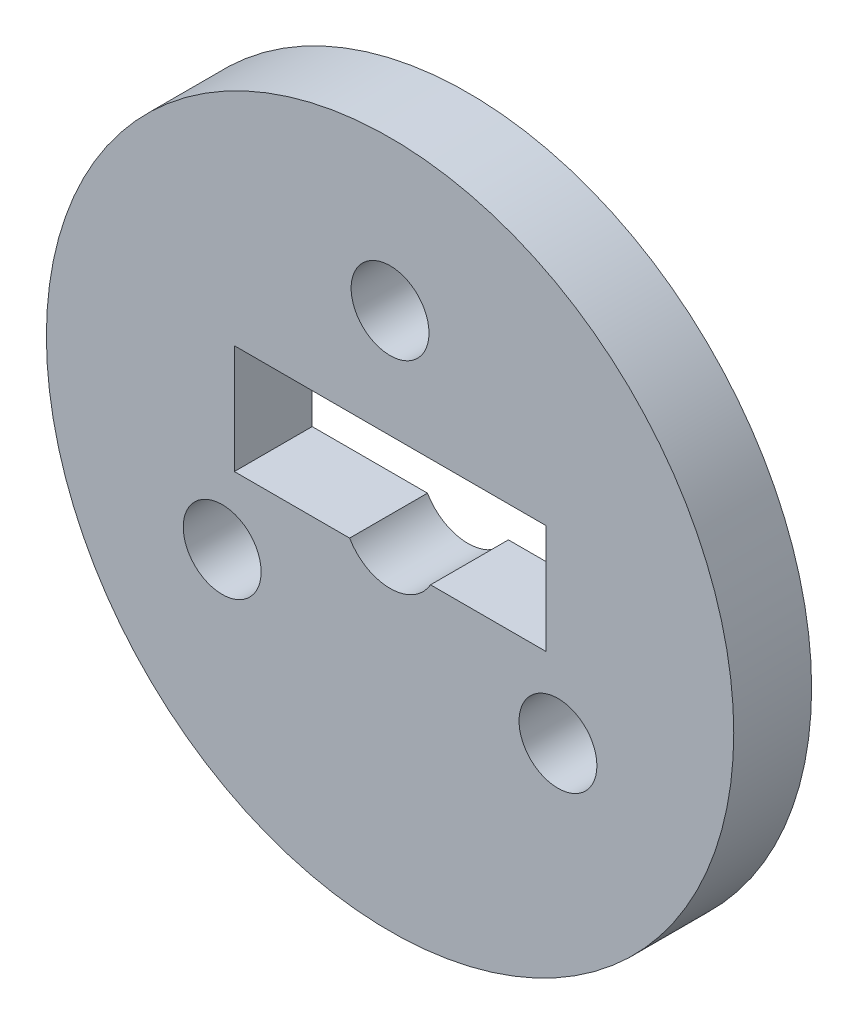
ISO-10303-21;
HEADER;
FILE_DESCRIPTION(('STEP AP214'),'2;1');
FILE_NAME('part.step','',(''),(''),'','','');
FILE_SCHEMA(('AUTOMOTIVE_DESIGN { 1 0 10303 214 1 1 1 1 }'));
ENDSEC;
DATA;
#1=APPLICATION_CONTEXT('core data for automotive mechanical design processes');
#2=APPLICATION_PROTOCOL_DEFINITION('international standard','automotive_design',2000,#1);
#3=PRODUCT_CONTEXT('',#1,'mechanical');
#4=PRODUCT('Part','Part','',(#3));
#5=PRODUCT_RELATED_PRODUCT_CATEGORY('part','',(#4));
#6=PRODUCT_DEFINITION_FORMATION('','',#4);
#7=PRODUCT_DEFINITION_CONTEXT('part definition',#1,'design');
#8=PRODUCT_DEFINITION('design','',#6,#7);
#9=PRODUCT_DEFINITION_SHAPE('','',#8);
#10=(LENGTH_UNIT() NAMED_UNIT(*) SI_UNIT(.MILLI.,.METRE.));
#11=(NAMED_UNIT(*) PLANE_ANGLE_UNIT() SI_UNIT($,.RADIAN.));
#12=(NAMED_UNIT(*) SI_UNIT($,.STERADIAN.) SOLID_ANGLE_UNIT());
#13=UNCERTAINTY_MEASURE_WITH_UNIT(LENGTH_MEASURE(1.E-05),#10,'distance_accuracy_value','');
#14=(GEOMETRIC_REPRESENTATION_CONTEXT(3) GLOBAL_UNCERTAINTY_ASSIGNED_CONTEXT((#13)) GLOBAL_UNIT_ASSIGNED_CONTEXT((#10,
#11,#12)) REPRESENTATION_CONTEXT('',''));
#15=CARTESIAN_POINT('',(0.,0.,0.));
#16=DIRECTION('',(0.,0.,1.));
#17=DIRECTION('',(1.,0.,0.));
#18=AXIS2_PLACEMENT_3D('',#15,#16,#17);
#19=CARTESIAN_POINT('',(0.,0.,5.));
#20=DIRECTION('',(0.,0.,-1.));
#21=DIRECTION('',(-1.,0.,0.));
#22=AXIS2_PLACEMENT_3D('',#19,#20,#21);
#23=CYLINDRICAL_SURFACE('',#22,3.);
#24=CARTESIAN_POINT('',(0.,0.,0.));
#25=DIRECTION('',(0.,0.,1.));
#26=DIRECTION('',(1.,0.,0.));
#27=AXIS2_PLACEMENT_3D('',#24,#25,#26);
#28=CIRCLE('',#27,3.);
#29=CARTESIAN_POINT('',(-2.59807621135332,-1.49999999999999,0.));
#30=VERTEX_POINT('',#29);
#31=CARTESIAN_POINT('',(2.59807621135332,-1.49999999999999,0.));
#32=VERTEX_POINT('',#31);
#33=EDGE_CURVE('E132',#30,#32,#28,.T.);
#34=ORIENTED_EDGE('',*,*,#33,.F.);
#35=DIRECTION('',(0.,0.,-1.));
#36=VECTOR('',#35,1.);
#37=CARTESIAN_POINT('',(-2.59807621135332,-1.49999999999999,5.));
#38=LINE('',#37,#36);
#39=CARTESIAN_POINT('',(-2.59807621135332,-1.49999999999999,5.));
#40=VERTEX_POINT('',#39);
#41=EDGE_CURVE('E11',#40,#30,#38,.T.);
#42=ORIENTED_EDGE('',*,*,#41,.F.);
#43=CARTESIAN_POINT('',(0.,0.,5.));
#44=DIRECTION('',(0.,0.,1.));
#45=DIRECTION('',(1.,0.,0.));
#46=AXIS2_PLACEMENT_3D('',#43,#44,#45);
#47=CIRCLE('',#46,3.);
#48=CARTESIAN_POINT('',(2.59807621135332,-1.49999999999999,5.));
#49=VERTEX_POINT('',#48);
#50=EDGE_CURVE('E157',#40,#49,#47,.T.);
#51=ORIENTED_EDGE('',*,*,#50,.T.);
#52=DIRECTION('',(0.,0.,-1.));
#53=VECTOR('',#52,1.);
#54=CARTESIAN_POINT('',(2.59807621135332,-1.49999999999999,5.));
#55=LINE('',#54,#53);
#56=EDGE_CURVE('E81',#49,#32,#55,.T.);
#57=ORIENTED_EDGE('',*,*,#56,.T.);
#58=EDGE_LOOP('',(#34,#42,#51,#57));
#59=FACE_BOUND('',#58,.T.);
#60=ADVANCED_FACE('F37',(#59),#23,.F.);
#61=CARTESIAN_POINT('',(0.,-1.49999999999999,5.));
#62=DIRECTION('',(0.,-1.,0.));
#63=DIRECTION('',(0.,0.,-1.));
#64=AXIS2_PLACEMENT_3D('',#61,#62,#63);
#65=PLANE('',#64);
#66=DIRECTION('',(-1.,0.,0.));
#67=VECTOR('',#66,1.);
#68=CARTESIAN_POINT('',(0.,-1.49999999999999,0.));
#69=LINE('',#68,#67);
#70=CARTESIAN_POINT('',(-10.,-1.49999999999999,0.));
#71=VERTEX_POINT('',#70);
#72=EDGE_CURVE('E135',#30,#71,#69,.T.);
#73=ORIENTED_EDGE('',*,*,#72,.T.);
#74=DIRECTION('',(0.,0.,-1.));
#75=VECTOR('',#74,1.);
#76=CARTESIAN_POINT('',(-10.,-1.49999999999999,5.));
#77=LINE('',#76,#75);
#78=CARTESIAN_POINT('',(-10.,-1.49999999999999,5.));
#79=VERTEX_POINT('',#78);
#80=EDGE_CURVE('E45',#79,#71,#77,.T.);
#81=ORIENTED_EDGE('',*,*,#80,.F.);
#82=DIRECTION('',(-1.,0.,0.));
#83=VECTOR('',#82,1.);
#84=CARTESIAN_POINT('',(0.,-1.49999999999999,5.));
#85=LINE('',#84,#83);
#86=EDGE_CURVE('E118',#40,#79,#85,.T.);
#87=ORIENTED_EDGE('',*,*,#86,.F.);
#88=ORIENTED_EDGE('',*,*,#41,.T.);
#89=EDGE_LOOP('',(#73,#81,#87,#88));
#90=FACE_BOUND('',#89,.T.);
#91=ADVANCED_FACE('F166',(#90),#65,.F.);
#92=CARTESIAN_POINT('',(-10.,0.,5.));
#93=DIRECTION('',(1.,0.,0.));
#94=DIRECTION('',(0.,1.,0.));
#95=AXIS2_PLACEMENT_3D('',#92,#93,#94);
#96=PLANE('',#95);
#97=DIRECTION('',(0.,-1.,0.));
#98=VECTOR('',#97,1.);
#99=CARTESIAN_POINT('',(-10.,0.,0.));
#100=LINE('',#99,#98);
#101=CARTESIAN_POINT('',(-10.0000000000001,5.50000000000001,0.));
#102=VERTEX_POINT('',#101);
#103=EDGE_CURVE('E138',#102,#71,#100,.T.);
#104=ORIENTED_EDGE('',*,*,#103,.F.);
#105=DIRECTION('',(0.,0.,-1.));
#106=VECTOR('',#105,1.);
#107=CARTESIAN_POINT('',(-10.0000000000001,5.50000000000001,5.));
#108=LINE('',#107,#106);
#109=CARTESIAN_POINT('',(-10.0000000000001,5.50000000000001,5.));
#110=VERTEX_POINT('',#109);
#111=EDGE_CURVE('E105',#110,#102,#108,.T.);
#112=ORIENTED_EDGE('',*,*,#111,.F.);
#113=DIRECTION('',(0.,-1.,0.));
#114=VECTOR('',#113,1.);
#115=CARTESIAN_POINT('',(-10.,0.,5.));
#116=LINE('',#115,#114);
#117=EDGE_CURVE('E112',#110,#79,#116,.T.);
#118=ORIENTED_EDGE('',*,*,#117,.T.);
#119=ORIENTED_EDGE('',*,*,#80,.T.);
#120=EDGE_LOOP('',(#104,#112,#118,#119));
#121=FACE_BOUND('',#120,.T.);
#122=ADVANCED_FACE('F163',(#121),#96,.T.);
#123=CARTESIAN_POINT('',(0.,5.50000000000001,5.));
#124=DIRECTION('',(0.,-1.,0.));
#125=DIRECTION('',(1.,0.,0.));
#126=AXIS2_PLACEMENT_3D('',#123,#124,#125);
#127=PLANE('',#126);
#128=DIRECTION('',(-1.,0.,0.));
#129=VECTOR('',#128,1.);
#130=CARTESIAN_POINT('',(0.,5.50000000000001,0.));
#131=LINE('',#130,#129);
#132=CARTESIAN_POINT('',(10.,5.50000000000001,0.));
#133=VERTEX_POINT('',#132);
#134=EDGE_CURVE('E100',#133,#102,#131,.T.);
#135=ORIENTED_EDGE('',*,*,#134,.F.);
#136=DIRECTION('',(0.,0.,-1.));
#137=VECTOR('',#136,1.);
#138=CARTESIAN_POINT('',(10.,5.50000000000001,5.));
#139=LINE('',#138,#137);
#140=CARTESIAN_POINT('',(10.,5.50000000000001,5.));
#141=VERTEX_POINT('',#140);
#142=EDGE_CURVE('E95',#141,#133,#139,.T.);
#143=ORIENTED_EDGE('',*,*,#142,.F.);
#144=DIRECTION('',(-1.,0.,0.));
#145=VECTOR('',#144,1.);
#146=CARTESIAN_POINT('',(0.,5.50000000000001,5.));
#147=LINE('',#146,#145);
#148=EDGE_CURVE('E98',#141,#110,#147,.T.);
#149=ORIENTED_EDGE('',*,*,#148,.T.);
#150=ORIENTED_EDGE('',*,*,#111,.T.);
#151=EDGE_LOOP('',(#135,#143,#149,#150));
#152=FACE_BOUND('',#151,.T.);
#153=ADVANCED_FACE('F97',(#152),#127,.T.);
#154=CARTESIAN_POINT('',(10.,0.,5.));
#155=DIRECTION('',(-1.,0.,0.));
#156=DIRECTION('',(0.,-1.,0.));
#157=AXIS2_PLACEMENT_3D('',#154,#155,#156);
#158=PLANE('',#157);
#159=DIRECTION('',(0.,1.,0.));
#160=VECTOR('',#159,1.);
#161=CARTESIAN_POINT('',(10.,0.,0.));
#162=LINE('',#161,#160);
#163=CARTESIAN_POINT('',(9.99999999999999,-1.49999999999999,0.));
#164=VERTEX_POINT('',#163);
#165=EDGE_CURVE('E143',#164,#133,#162,.T.);
#166=ORIENTED_EDGE('',*,*,#165,.F.);
#167=DIRECTION('',(0.,0.,-1.));
#168=VECTOR('',#167,1.);
#169=CARTESIAN_POINT('',(9.99999999999999,-1.49999999999999,5.));
#170=LINE('',#169,#168);
#171=CARTESIAN_POINT('',(9.99999999999999,-1.49999999999999,5.));
#172=VERTEX_POINT('',#171);
#173=EDGE_CURVE('E74',#172,#164,#170,.T.);
#174=ORIENTED_EDGE('',*,*,#173,.F.);
#175=DIRECTION('',(0.,1.,0.));
#176=VECTOR('',#175,1.);
#177=CARTESIAN_POINT('',(10.,0.,5.));
#178=LINE('',#177,#176);
#179=EDGE_CURVE('E110',#172,#141,#178,.T.);
#180=ORIENTED_EDGE('',*,*,#179,.T.);
#181=ORIENTED_EDGE('',*,*,#142,.T.);
#182=EDGE_LOOP('',(#166,#174,#180,#181));
#183=FACE_BOUND('',#182,.T.);
#184=ADVANCED_FACE('F114',(#183),#158,.T.);
#185=CARTESIAN_POINT('',(0.,12.45,5.));
#186=DIRECTION('',(0.,0.,-1.));
#187=DIRECTION('',(-1.,0.,0.));
#188=AXIS2_PLACEMENT_3D('',#185,#186,#187);
#189=CYLINDRICAL_SURFACE('',#188,2.5);
#190=CARTESIAN_POINT('',(0.,12.45,5.));
#191=DIRECTION('',(0.,0.,1.));
#192=DIRECTION('',(1.,0.,0.));
#193=AXIS2_PLACEMENT_3D('',#190,#191,#192);
#194=CIRCLE('',#193,2.5);
#195=CARTESIAN_POINT('',(2.5,12.45,5.));
#196=VERTEX_POINT('',#195);
#197=EDGE_CURVE('E126',#196,#196,#194,.T.);
#198=ORIENTED_EDGE('',*,*,#197,.T.);
#199=EDGE_LOOP('',(#198));
#200=FACE_BOUND('',#199,.T.);
#201=CARTESIAN_POINT('',(0.,12.45,0.));
#202=DIRECTION('',(0.,0.,1.));
#203=DIRECTION('',(1.,0.,0.));
#204=AXIS2_PLACEMENT_3D('',#201,#202,#203);
#205=CIRCLE('',#204,2.5);
#206=CARTESIAN_POINT('',(2.5,12.45,0.));
#207=VERTEX_POINT('',#206);
#208=EDGE_CURVE('E151',#207,#207,#205,.T.);
#209=ORIENTED_EDGE('',*,*,#208,.F.);
#210=EDGE_LOOP('',(#209));
#211=FACE_BOUND('',#210,.T.);
#212=ADVANCED_FACE('F196',(#200,#211),#189,.F.);
#213=CARTESIAN_POINT('',(10.7820162771163,-6.225,5.));
#214=DIRECTION('',(0.,0.,-1.));
#215=DIRECTION('',(-1.,0.,0.));
#216=AXIS2_PLACEMENT_3D('',#213,#214,#215);
#217=CYLINDRICAL_SURFACE('',#216,2.5);
#218=CARTESIAN_POINT('',(10.7820162771163,-6.225,5.));
#219=DIRECTION('',(0.,0.,1.));
#220=DIRECTION('',(1.,0.,0.));
#221=AXIS2_PLACEMENT_3D('',#218,#219,#220);
#222=CIRCLE('',#221,2.5);
#223=CARTESIAN_POINT('',(13.2820162771163,-6.225,5.));
#224=VERTEX_POINT('',#223);
#225=EDGE_CURVE('E123',#224,#224,#222,.T.);
#226=ORIENTED_EDGE('',*,*,#225,.T.);
#227=EDGE_LOOP('',(#226));
#228=FACE_BOUND('',#227,.T.);
#229=CARTESIAN_POINT('',(10.7820162771163,-6.225,0.));
#230=DIRECTION('',(0.,0.,1.));
#231=DIRECTION('',(1.,0.,0.));
#232=AXIS2_PLACEMENT_3D('',#229,#230,#231);
#233=CIRCLE('',#232,2.5);
#234=CARTESIAN_POINT('',(13.2820162771163,-6.225,0.));
#235=VERTEX_POINT('',#234);
#236=EDGE_CURVE('E148',#235,#235,#233,.T.);
#237=ORIENTED_EDGE('',*,*,#236,.F.);
#238=EDGE_LOOP('',(#237));
#239=FACE_BOUND('',#238,.T.);
#240=ADVANCED_FACE('F191',(#228,#239),#217,.F.);
#241=CARTESIAN_POINT('',(-10.7820162771163,-6.225,5.));
#242=DIRECTION('',(0.,0.,-1.));
#243=DIRECTION('',(-1.,0.,0.));
#244=AXIS2_PLACEMENT_3D('',#241,#242,#243);
#245=CYLINDRICAL_SURFACE('',#244,2.5);
#246=CARTESIAN_POINT('',(-10.7820162771163,-6.225,5.));
#247=DIRECTION('',(0.,0.,1.));
#248=DIRECTION('',(1.,0.,0.));
#249=AXIS2_PLACEMENT_3D('',#246,#247,#248);
#250=CIRCLE('',#249,2.5);
#251=CARTESIAN_POINT('',(-8.28201627711626,-6.225,5.));
#252=VERTEX_POINT('',#251);
#253=EDGE_CURVE('E116',#252,#252,#250,.T.);
#254=ORIENTED_EDGE('',*,*,#253,.T.);
#255=EDGE_LOOP('',(#254));
#256=FACE_BOUND('',#255,.T.);
#257=CARTESIAN_POINT('',(-10.7820162771163,-6.225,0.));
#258=DIRECTION('',(0.,0.,1.));
#259=DIRECTION('',(1.,0.,0.));
#260=AXIS2_PLACEMENT_3D('',#257,#258,#259);
#261=CIRCLE('',#260,2.5);
#262=CARTESIAN_POINT('',(-8.28201627711626,-6.225,0.));
#263=VERTEX_POINT('',#262);
#264=EDGE_CURVE('E145',#263,#263,#261,.T.);
#265=ORIENTED_EDGE('',*,*,#264,.F.);
#266=EDGE_LOOP('',(#265));
#267=FACE_BOUND('',#266,.T.);
#268=ADVANCED_FACE('F184',(#256,#267),#245,.F.);
#269=EDGE_CURVE('E139',#164,#32,#69,.T.);
#270=ORIENTED_EDGE('',*,*,#269,.T.);
#271=ORIENTED_EDGE('',*,*,#56,.F.);
#272=EDGE_CURVE('E53',#172,#49,#85,.T.);
#273=ORIENTED_EDGE('',*,*,#272,.F.);
#274=ORIENTED_EDGE('',*,*,#173,.T.);
#275=EDGE_LOOP('',(#270,#271,#273,#274));
#276=FACE_BOUND('',#275,.T.);
#277=ADVANCED_FACE('F170',(#276),#65,.F.);
#278=CARTESIAN_POINT('',(0.,0.,5.));
#279=DIRECTION('',(0.,0.,-1.));
#280=DIRECTION('',(-1.,0.,0.));
#281=AXIS2_PLACEMENT_3D('',#278,#279,#280);
#282=CYLINDRICAL_SURFACE('',#281,22.0716390642382);
#283=CARTESIAN_POINT('',(0.,0.,5.));
#284=DIRECTION('',(0.,0.,1.));
#285=DIRECTION('',(1.,0.,0.));
#286=AXIS2_PLACEMENT_3D('',#283,#284,#285);
#287=CIRCLE('',#286,22.0716390642382);
#288=CARTESIAN_POINT('',(22.0716390642382,0.,5.));
#289=VERTEX_POINT('',#288);
#290=EDGE_CURVE('E129',#289,#289,#287,.T.);
#291=ORIENTED_EDGE('',*,*,#290,.F.);
#292=EDGE_LOOP('',(#291));
#293=FACE_BOUND('',#292,.T.);
#294=CARTESIAN_POINT('',(0.,0.,0.));
#295=DIRECTION('',(0.,0.,1.));
#296=DIRECTION('',(1.,0.,0.));
#297=AXIS2_PLACEMENT_3D('',#294,#295,#296);
#298=CIRCLE('',#297,22.0716390642382);
#299=CARTESIAN_POINT('',(22.0716390642382,0.,0.));
#300=VERTEX_POINT('',#299);
#301=EDGE_CURVE('E154',#300,#300,#298,.T.);
#302=ORIENTED_EDGE('',*,*,#301,.T.);
#303=EDGE_LOOP('',(#302));
#304=FACE_BOUND('',#303,.T.);
#305=ADVANCED_FACE('F183',(#293,#304),#282,.T.);
#306=CARTESIAN_POINT('',(0.,0.,5.));
#307=DIRECTION('',(0.,0.,1.));
#308=DIRECTION('',(1.,0.,0.));
#309=AXIS2_PLACEMENT_3D('',#306,#307,#308);
#310=PLANE('',#309);
#311=ORIENTED_EDGE('',*,*,#50,.F.);
#312=ORIENTED_EDGE('',*,*,#86,.T.);
#313=ORIENTED_EDGE('',*,*,#117,.F.);
#314=ORIENTED_EDGE('',*,*,#148,.F.);
#315=ORIENTED_EDGE('',*,*,#179,.F.);
#316=ORIENTED_EDGE('',*,*,#272,.T.);
#317=EDGE_LOOP('',(#311,#312,#313,#314,#315,#316));
#318=FACE_BOUND('',#317,.T.);
#319=ORIENTED_EDGE('',*,*,#253,.F.);
#320=EDGE_LOOP('',(#319));
#321=FACE_BOUND('',#320,.T.);
#322=ORIENTED_EDGE('',*,*,#225,.F.);
#323=EDGE_LOOP('',(#322));
#324=FACE_BOUND('',#323,.T.);
#325=ORIENTED_EDGE('',*,*,#197,.F.);
#326=EDGE_LOOP('',(#325));
#327=FACE_BOUND('',#326,.T.);
#328=ORIENTED_EDGE('',*,*,#290,.T.);
#329=EDGE_LOOP('',(#328));
#330=FACE_BOUND('',#329,.T.);
#331=ADVANCED_FACE('F108',(#318,#321,#324,#327,#330),#310,.T.);
#332=CARTESIAN_POINT('',(0.,0.,0.));
#333=DIRECTION('',(0.,0.,1.));
#334=DIRECTION('',(1.,0.,0.));
#335=AXIS2_PLACEMENT_3D('',#332,#333,#334);
#336=PLANE('',#335);
#337=ORIENTED_EDGE('',*,*,#33,.T.);
#338=ORIENTED_EDGE('',*,*,#269,.F.);
#339=ORIENTED_EDGE('',*,*,#165,.T.);
#340=ORIENTED_EDGE('',*,*,#134,.T.);
#341=ORIENTED_EDGE('',*,*,#103,.T.);
#342=ORIENTED_EDGE('',*,*,#72,.F.);
#343=EDGE_LOOP('',(#337,#338,#339,#340,#341,#342));
#344=FACE_BOUND('',#343,.T.);
#345=ORIENTED_EDGE('',*,*,#264,.T.);
#346=EDGE_LOOP('',(#345));
#347=FACE_BOUND('',#346,.T.);
#348=ORIENTED_EDGE('',*,*,#236,.T.);
#349=EDGE_LOOP('',(#348));
#350=FACE_BOUND('',#349,.T.);
#351=ORIENTED_EDGE('',*,*,#208,.T.);
#352=EDGE_LOOP('',(#351));
#353=FACE_BOUND('',#352,.T.);
#354=ORIENTED_EDGE('',*,*,#301,.F.);
#355=EDGE_LOOP('',(#354));
#356=FACE_BOUND('',#355,.T.);
#357=ADVANCED_FACE('F168',(#344,#347,#350,#353,#356),#336,.F.);
#358=CLOSED_SHELL('',(#60,#91,#122,#153,#184,#212,#240,#268,#277,#305,#331,#357));
#359=MANIFOLD_SOLID_BREP('B2',#358);
#360=ADVANCED_BREP_SHAPE_REPRESENTATION('',(#18,#359),#14);
#361=SHAPE_DEFINITION_REPRESENTATION(#9,#360);
ENDSEC;
END-ISO-10303-21;
